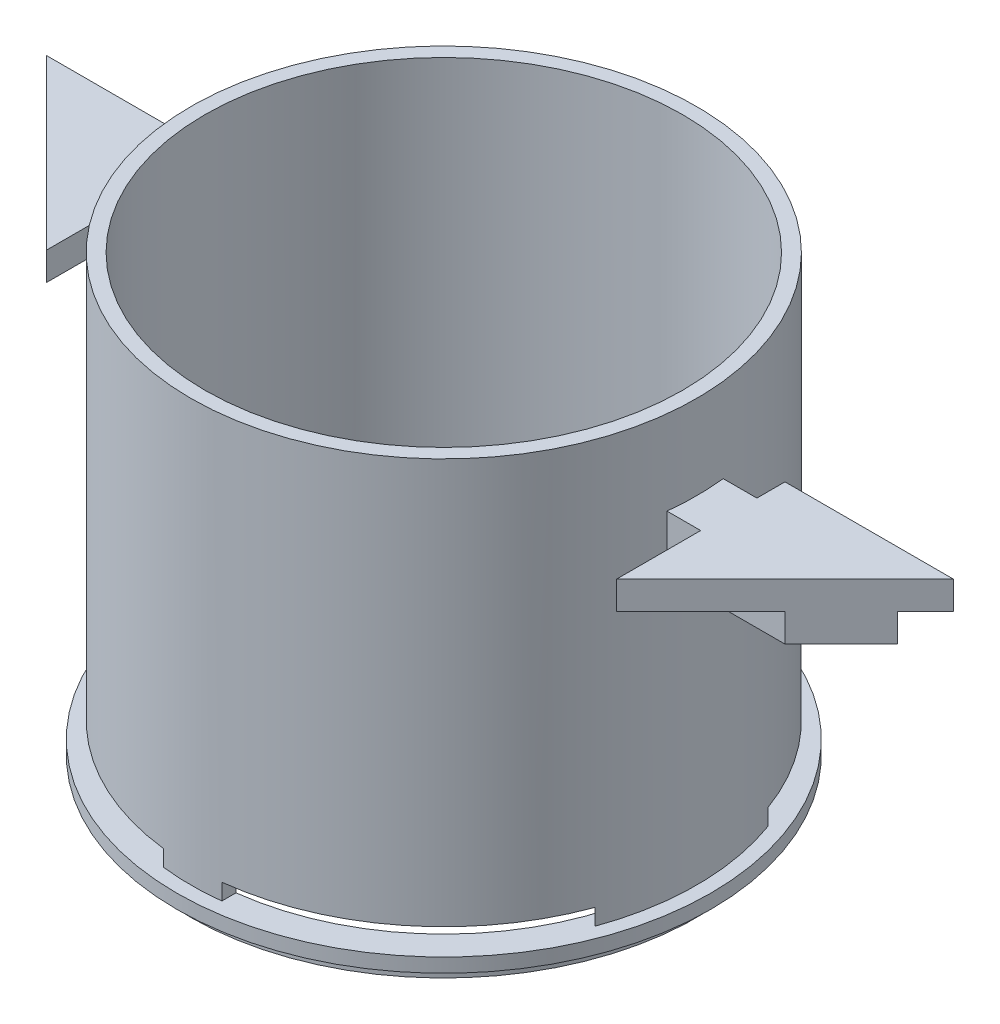
ISO-10303-21;
HEADER;
FILE_DESCRIPTION(('STEP AP214'),'2;1');
FILE_NAME('part.step','',(''),(''),'','','');
FILE_SCHEMA(('AUTOMOTIVE_DESIGN { 1 0 10303 214 1 1 1 1 }'));
ENDSEC;
DATA;
#1=APPLICATION_CONTEXT('core data for automotive mechanical design processes');
#2=APPLICATION_PROTOCOL_DEFINITION('international standard','automotive_design',2000,#1);
#3=PRODUCT_CONTEXT('',#1,'mechanical');
#4=PRODUCT('Part','Part','',(#3));
#5=PRODUCT_RELATED_PRODUCT_CATEGORY('part','',(#4));
#6=PRODUCT_DEFINITION_FORMATION('','',#4);
#7=PRODUCT_DEFINITION_CONTEXT('part definition',#1,'design');
#8=PRODUCT_DEFINITION('design','',#6,#7);
#9=PRODUCT_DEFINITION_SHAPE('','',#8);
#10=(LENGTH_UNIT() NAMED_UNIT(*) SI_UNIT(.MILLI.,.METRE.));
#11=(NAMED_UNIT(*) PLANE_ANGLE_UNIT() SI_UNIT($,.RADIAN.));
#12=(NAMED_UNIT(*) SI_UNIT($,.STERADIAN.) SOLID_ANGLE_UNIT());
#13=UNCERTAINTY_MEASURE_WITH_UNIT(LENGTH_MEASURE(1.E-05),#10,'distance_accuracy_value','');
#14=(GEOMETRIC_REPRESENTATION_CONTEXT(3) GLOBAL_UNCERTAINTY_ASSIGNED_CONTEXT((#13)) GLOBAL_UNIT_ASSIGNED_CONTEXT((#10,
#11,#12)) REPRESENTATION_CONTEXT('',''));
#15=CARTESIAN_POINT('',(0.,0.,0.));
#16=DIRECTION('',(0.,0.,1.));
#17=DIRECTION('',(1.,0.,0.));
#18=AXIS2_PLACEMENT_3D('',#15,#16,#17);
#19=CARTESIAN_POINT('',(96.1525636,82.55,-6.35));
#20=DIRECTION('',(0.,0.,-1.));
#21=DIRECTION('',(-1.,0.,0.));
#22=AXIS2_PLACEMENT_3D('',#19,#20,#21);
#23=PLANE('',#22);
#24=DIRECTION('',(1.,0.,0.));
#25=VECTOR('',#24,1.);
#26=CARTESIAN_POINT('',(96.1525636,82.55,-6.35));
#27=LINE('',#26,#25);
#28=CARTESIAN_POINT('',(56.7961266284947,82.55,-6.35));
#29=VERTEX_POINT('',#28);
#30=CARTESIAN_POINT('',(64.4025636,82.55,-6.35));
#31=VERTEX_POINT('',#30);
#32=EDGE_CURVE('E313',#29,#31,#27,.T.);
#33=ORIENTED_EDGE('',*,*,#32,.T.);
#34=DIRECTION('',(0.,-1.,0.));
#35=VECTOR('',#34,1.);
#36=CARTESIAN_POINT('',(64.4025636,82.55,-6.35));
#37=LINE('',#36,#35);
#38=CARTESIAN_POINT('',(64.4025636,76.2,-6.35));
#39=VERTEX_POINT('',#38);
#40=EDGE_CURVE('E58',#31,#39,#37,.T.);
#41=ORIENTED_EDGE('',*,*,#40,.T.);
#42=DIRECTION('',(1.,0.,0.));
#43=VECTOR('',#42,1.);
#44=CARTESIAN_POINT('',(96.1525636,76.2,-6.35));
#45=LINE('',#44,#43);
#46=CARTESIAN_POINT('',(96.1525636,76.2,-6.35));
#47=VERTEX_POINT('',#46);
#48=EDGE_CURVE('E305',#39,#47,#45,.T.);
#49=ORIENTED_EDGE('',*,*,#48,.T.);
#50=DIRECTION('',(0.,-1.,0.));
#51=VECTOR('',#50,1.);
#52=CARTESIAN_POINT('',(96.1525636,82.55,-6.35));
#53=LINE('',#52,#51);
#54=CARTESIAN_POINT('',(96.1525636,69.85,-6.35));
#55=VERTEX_POINT('',#54);
#56=EDGE_CURVE('E289',#47,#55,#53,.T.);
#57=ORIENTED_EDGE('',*,*,#56,.T.);
#58=DIRECTION('',(1.,0.,0.));
#59=VECTOR('',#58,1.);
#60=CARTESIAN_POINT('',(96.1525636,69.85,-6.35));
#61=LINE('',#60,#59);
#62=CARTESIAN_POINT('',(56.7961266284947,69.85,-6.35));
#63=VERTEX_POINT('',#62);
#64=EDGE_CURVE('E321',#63,#55,#61,.T.);
#65=ORIENTED_EDGE('',*,*,#64,.F.);
#66=DIRECTION('',(0.,-1.,0.));
#67=VECTOR('',#66,1.);
#68=CARTESIAN_POINT('',(56.7961266284947,101.6,-6.35));
#69=LINE('',#68,#67);
#70=EDGE_CURVE('E336',#29,#63,#69,.T.);
#71=ORIENTED_EDGE('',*,*,#70,.F.);
#72=EDGE_LOOP('',(#33,#41,#49,#57,#65,#71));
#73=FACE_BOUND('',#72,.T.);
#74=ADVANCED_FACE('F43',(#73),#23,.T.);
#75=CARTESIAN_POINT('',(83.4525635999997,82.55,6.35));
#76=DIRECTION('',(0.,0.,1.));
#77=DIRECTION('',(1.,0.,0.));
#78=AXIS2_PLACEMENT_3D('',#75,#76,#77);
#79=PLANE('',#78);
#80=DIRECTION('',(-1.,0.,0.));
#81=VECTOR('',#80,1.);
#82=CARTESIAN_POINT('',(83.4525635999997,76.2,6.35));
#83=LINE('',#82,#81);
#84=CARTESIAN_POINT('',(83.4525635999997,76.2,6.35));
#85=VERTEX_POINT('',#84);
#86=CARTESIAN_POINT('',(64.4025636,76.2,6.35));
#87=VERTEX_POINT('',#86);
#88=EDGE_CURVE('E66',#85,#87,#83,.T.);
#89=ORIENTED_EDGE('',*,*,#88,.T.);
#90=DIRECTION('',(0.,1.,0.));
#91=VECTOR('',#90,1.);
#92=CARTESIAN_POINT('',(64.4025636,82.55,6.35));
#93=LINE('',#92,#91);
#94=CARTESIAN_POINT('',(64.4025636,82.55,6.35));
#95=VERTEX_POINT('',#94);
#96=EDGE_CURVE('E307',#87,#95,#93,.T.);
#97=ORIENTED_EDGE('',*,*,#96,.T.);
#98=DIRECTION('',(-1.,0.,0.));
#99=VECTOR('',#98,1.);
#100=CARTESIAN_POINT('',(83.4525635999997,82.55,6.35));
#101=LINE('',#100,#99);
#102=CARTESIAN_POINT('',(56.7961266284947,82.55,6.35));
#103=VERTEX_POINT('',#102);
#104=EDGE_CURVE('E316',#95,#103,#101,.T.);
#105=ORIENTED_EDGE('',*,*,#104,.T.);
#106=DIRECTION('',(0.,-1.,0.));
#107=VECTOR('',#106,1.);
#108=CARTESIAN_POINT('',(56.7961266284947,101.6,6.35));
#109=LINE('',#108,#107);
#110=CARTESIAN_POINT('',(56.7961266284947,69.85,6.35));
#111=VERTEX_POINT('',#110);
#112=EDGE_CURVE('E333',#111,#103,#109,.F.);
#113=ORIENTED_EDGE('',*,*,#112,.F.);
#114=DIRECTION('',(-1.,0.,0.));
#115=VECTOR('',#114,1.);
#116=CARTESIAN_POINT('',(83.4525635999997,69.85,6.35));
#117=LINE('',#116,#115);
#118=CARTESIAN_POINT('',(83.4525635999997,69.85,6.35));
#119=VERTEX_POINT('',#118);
#120=EDGE_CURVE('E314',#119,#111,#117,.T.);
#121=ORIENTED_EDGE('',*,*,#120,.F.);
#122=DIRECTION('',(0.,-1.,0.));
#123=VECTOR('',#122,1.);
#124=CARTESIAN_POINT('',(83.4525635999997,82.55,6.35));
#125=LINE('',#124,#123);
#126=EDGE_CURVE('E318',#85,#119,#125,.T.);
#127=ORIENTED_EDGE('',*,*,#126,.F.);
#128=EDGE_LOOP('',(#89,#97,#105,#113,#121,#127));
#129=FACE_BOUND('',#128,.T.);
#130=ADVANCED_FACE('F591',(#129),#79,.T.);
#131=CARTESIAN_POINT('',(0.,101.6,0.));
#132=DIRECTION('',(0.,-1.,0.));
#133=DIRECTION('',(0.,0.,-1.));
#134=AXIS2_PLACEMENT_3D('',#131,#132,#133);
#135=CYLINDRICAL_SURFACE('',#134,57.15);
#136=CARTESIAN_POINT('',(0.,0.,0.));
#137=DIRECTION('',(0.,1.,0.));
#138=DIRECTION('',(0.,0.,1.));
#139=AXIS2_PLACEMENT_3D('',#136,#137,#138);
#140=CIRCLE('',#139,57.15);
#141=CARTESIAN_POINT('',(0.,0.,57.15));
#142=VERTEX_POINT('',#141);
#143=EDGE_CURVE('E481',#142,#142,#140,.T.);
#144=ORIENTED_EDGE('',*,*,#143,.T.);
#145=EDGE_LOOP('',(#144));
#146=FACE_BOUND('',#145,.T.);
#147=CARTESIAN_POINT('',(0.,3.175,0.));
#148=DIRECTION('',(0.,1.,0.));
#149=DIRECTION('',(0.,0.,1.));
#150=AXIS2_PLACEMENT_3D('',#147,#148,#149);
#151=CIRCLE('',#150,57.15);
#152=CARTESIAN_POINT('',(0.,3.175,57.15));
#153=VERTEX_POINT('',#152);
#154=EDGE_CURVE('E11',#153,#153,#151,.T.);
#155=ORIENTED_EDGE('',*,*,#154,.F.);
#156=EDGE_LOOP('',(#155));
#157=FACE_BOUND('',#156,.T.);
#158=ADVANCED_FACE('F596',(#146,#157),#135,.T.);
#159=ORIENTED_EDGE('',*,*,#112,.T.);
#160=CARTESIAN_POINT('',(0.,82.55,0.));
#161=DIRECTION('',(0.,1.,0.));
#162=DIRECTION('',(0.,0.,1.));
#163=AXIS2_PLACEMENT_3D('',#160,#161,#162);
#164=CIRCLE('',#163,57.15);
#165=EDGE_CURVE('E331',#103,#29,#164,.T.);
#166=ORIENTED_EDGE('',*,*,#165,.T.);
#167=ORIENTED_EDGE('',*,*,#70,.T.);
#168=CARTESIAN_POINT('',(0.,69.85,0.));
#169=DIRECTION('',(0.,1.,0.));
#170=DIRECTION('',(0.,0.,1.));
#171=AXIS2_PLACEMENT_3D('',#168,#169,#170);
#172=CIRCLE('',#171,57.15);
#173=EDGE_CURVE('E328',#111,#63,#172,.T.);
#174=ORIENTED_EDGE('',*,*,#173,.F.);
#175=EDGE_LOOP('',(#159,#166,#167,#174));
#176=FACE_BOUND('',#175,.T.);
#177=DIRECTION('',(0.,-1.,0.));
#178=VECTOR('',#177,1.);
#179=CARTESIAN_POINT('',(-56.7961266284947,101.6,-6.35));
#180=LINE('',#179,#178);
#181=CARTESIAN_POINT('',(-56.7961266284947,82.55,-6.35));
#182=VERTEX_POINT('',#181);
#183=CARTESIAN_POINT('',(-56.7961266284947,69.85,-6.35));
#184=VERTEX_POINT('',#183);
#185=EDGE_CURVE('E400',#182,#184,#180,.T.);
#186=ORIENTED_EDGE('',*,*,#185,.F.);
#187=CARTESIAN_POINT('',(0.,82.55,0.));
#188=DIRECTION('',(0.,1.,0.));
#189=DIRECTION('',(0.,0.,1.));
#190=AXIS2_PLACEMENT_3D('',#187,#188,#189);
#191=CIRCLE('',#190,57.15);
#192=CARTESIAN_POINT('',(-56.7961266284947,82.55,6.35));
#193=VERTEX_POINT('',#192);
#194=EDGE_CURVE('E397',#182,#193,#191,.T.);
#195=ORIENTED_EDGE('',*,*,#194,.T.);
#196=DIRECTION('',(0.,-1.,0.));
#197=VECTOR('',#196,1.);
#198=CARTESIAN_POINT('',(-56.7961266284947,101.6,6.35));
#199=LINE('',#198,#197);
#200=CARTESIAN_POINT('',(-56.7961266284947,69.85,6.35));
#201=VERTEX_POINT('',#200);
#202=EDGE_CURVE('E403',#201,#193,#199,.F.);
#203=ORIENTED_EDGE('',*,*,#202,.F.);
#204=CARTESIAN_POINT('',(0.,69.85,0.));
#205=DIRECTION('',(0.,1.,0.));
#206=DIRECTION('',(0.,0.,1.));
#207=AXIS2_PLACEMENT_3D('',#204,#205,#206);
#208=CIRCLE('',#207,57.15);
#209=EDGE_CURVE('E394',#184,#201,#208,.T.);
#210=ORIENTED_EDGE('',*,*,#209,.F.);
#211=EDGE_LOOP('',(#186,#195,#203,#210));
#212=FACE_BOUND('',#211,.T.);
#213=DIRECTION('',(0.,-1.,0.));
#214=VECTOR('',#213,1.);
#215=CARTESIAN_POINT('',(53.721,101.6,19.4981193708522));
#216=LINE('',#215,#214);
#217=CARTESIAN_POINT('',(53.721,10.033,19.4981193708522));
#218=VERTEX_POINT('',#217);
#219=CARTESIAN_POINT('',(53.721,6.34999999999999,19.4981193708522));
#220=VERTEX_POINT('',#219);
#221=EDGE_CURVE('E454',#218,#220,#216,.T.);
#222=ORIENTED_EDGE('',*,*,#221,.T.);
#223=CARTESIAN_POINT('',(0.,6.35,0.));
#224=DIRECTION('',(0.,1.,0.));
#225=DIRECTION('',(0.,0.,1.));
#226=AXIS2_PLACEMENT_3D('',#223,#224,#225);
#227=CIRCLE('',#226,57.15);
#228=CARTESIAN_POINT('',(53.721,6.34999999999999,-19.4981193708522));
#229=VERTEX_POINT('',#228);
#230=EDGE_CURVE('E409',#220,#229,#227,.T.);
#231=ORIENTED_EDGE('',*,*,#230,.T.);
#232=DIRECTION('',(0.,-1.,0.));
#233=VECTOR('',#232,1.);
#234=CARTESIAN_POINT('',(53.721,101.6,-19.4981193708522));
#235=LINE('',#234,#233);
#236=CARTESIAN_POINT('',(53.721,10.033,-19.4981193708522));
#237=VERTEX_POINT('',#236);
#238=EDGE_CURVE('E451',#229,#237,#235,.F.);
#239=ORIENTED_EDGE('',*,*,#238,.T.);
#240=CARTESIAN_POINT('',(0.,10.033,0.));
#241=DIRECTION('',(0.,1.,0.));
#242=DIRECTION('',(0.,0.,1.));
#243=AXIS2_PLACEMENT_3D('',#240,#241,#242);
#244=CIRCLE('',#243,57.15);
#245=CARTESIAN_POINT('',(6.604,10.033,-56.7671532138084));
#246=VERTEX_POINT('',#245);
#247=EDGE_CURVE('E457',#237,#246,#244,.T.);
#248=ORIENTED_EDGE('',*,*,#247,.T.);
#249=DIRECTION('',(0.,-1.,0.));
#250=VECTOR('',#249,1.);
#251=CARTESIAN_POINT('',(6.604,101.6,-56.7671532138084));
#252=LINE('',#251,#250);
#253=CARTESIAN_POINT('',(6.604,6.34999999999999,-56.7671532138084));
#254=VERTEX_POINT('',#253);
#255=EDGE_CURVE('E448',#246,#254,#252,.T.);
#256=ORIENTED_EDGE('',*,*,#255,.T.);
#257=CARTESIAN_POINT('',(-6.604,6.35,-56.7671532138084));
#258=VERTEX_POINT('',#257);
#259=EDGE_CURVE('E549',#254,#258,#227,.T.);
#260=ORIENTED_EDGE('',*,*,#259,.T.);
#261=DIRECTION('',(0.,-1.,0.));
#262=VECTOR('',#261,1.);
#263=CARTESIAN_POINT('',(-6.604,101.6,-56.7671532138084));
#264=LINE('',#263,#262);
#265=CARTESIAN_POINT('',(-6.604,10.033,-56.7671532138084));
#266=VERTEX_POINT('',#265);
#267=EDGE_CURVE('E461',#258,#266,#264,.F.);
#268=ORIENTED_EDGE('',*,*,#267,.T.);
#269=CARTESIAN_POINT('',(0.,10.033,0.));
#270=DIRECTION('',(0.,1.,0.));
#271=DIRECTION('',(0.,0.,1.));
#272=AXIS2_PLACEMENT_3D('',#269,#270,#271);
#273=CIRCLE('',#272,57.15);
#274=CARTESIAN_POINT('',(-53.721,10.033,-19.4981193708522));
#275=VERTEX_POINT('',#274);
#276=EDGE_CURVE('E470',#266,#275,#273,.T.);
#277=ORIENTED_EDGE('',*,*,#276,.T.);
#278=DIRECTION('',(0.,-1.,0.));
#279=VECTOR('',#278,1.);
#280=CARTESIAN_POINT('',(-53.721,101.6,-19.4981193708522));
#281=LINE('',#280,#279);
#282=CARTESIAN_POINT('',(-53.721,6.34999999999999,-19.4981193708522));
#283=VERTEX_POINT('',#282);
#284=EDGE_CURVE('E474',#275,#283,#281,.T.);
#285=ORIENTED_EDGE('',*,*,#284,.T.);
#286=CARTESIAN_POINT('',(-53.721,6.34999999999999,19.4981193708522));
#287=VERTEX_POINT('',#286);
#288=EDGE_CURVE('E408',#283,#287,#227,.T.);
#289=ORIENTED_EDGE('',*,*,#288,.T.);
#290=DIRECTION('',(0.,-1.,0.));
#291=VECTOR('',#290,1.);
#292=CARTESIAN_POINT('',(-53.721,101.6,19.4981193708522));
#293=LINE('',#292,#291);
#294=CARTESIAN_POINT('',(-53.721,10.033,19.4981193708522));
#295=VERTEX_POINT('',#294);
#296=EDGE_CURVE('E471',#287,#295,#293,.F.);
#297=ORIENTED_EDGE('',*,*,#296,.T.);
#298=CARTESIAN_POINT('',(-6.604,10.033,56.7671532138084));
#299=VERTEX_POINT('',#298);
#300=EDGE_CURVE('E467',#295,#299,#273,.T.);
#301=ORIENTED_EDGE('',*,*,#300,.T.);
#302=DIRECTION('',(0.,-1.,0.));
#303=VECTOR('',#302,1.);
#304=CARTESIAN_POINT('',(-6.604,101.6,56.7671532138084));
#305=LINE('',#304,#303);
#306=CARTESIAN_POINT('',(-6.604,6.34999999999999,56.7671532138084));
#307=VERTEX_POINT('',#306);
#308=EDGE_CURVE('E464',#299,#307,#305,.T.);
#309=ORIENTED_EDGE('',*,*,#308,.T.);
#310=CARTESIAN_POINT('',(6.604,6.35,56.7671532138084));
#311=VERTEX_POINT('',#310);
#312=EDGE_CURVE('E406',#307,#311,#227,.T.);
#313=ORIENTED_EDGE('',*,*,#312,.T.);
#314=DIRECTION('',(0.,-1.,0.));
#315=VECTOR('',#314,1.);
#316=CARTESIAN_POINT('',(6.604,101.6,56.7671532138084));
#317=LINE('',#316,#315);
#318=CARTESIAN_POINT('',(6.604,10.033,56.7671532138084));
#319=VERTEX_POINT('',#318);
#320=EDGE_CURVE('E445',#311,#319,#317,.F.);
#321=ORIENTED_EDGE('',*,*,#320,.T.);
#322=EDGE_CURVE('E460',#319,#218,#244,.T.);
#323=ORIENTED_EDGE('',*,*,#322,.T.);
#324=EDGE_LOOP('',(#222,#231,#239,#248,#256,#260,#268,#277,#285,#289,#297,#301,#309,#313,#321,#323));
#325=FACE_BOUND('',#324,.T.);
#326=CARTESIAN_POINT('',(0.,101.6,0.));
#327=DIRECTION('',(0.,1.,0.));
#328=DIRECTION('',(0.,0.,1.));
#329=AXIS2_PLACEMENT_3D('',#326,#327,#328);
#330=CIRCLE('',#329,57.15);
#331=CARTESIAN_POINT('',(0.,101.6,57.15));
#332=VERTEX_POINT('',#331);
#333=EDGE_CURVE('E484',#332,#332,#330,.T.);
#334=ORIENTED_EDGE('',*,*,#333,.F.);
#335=EDGE_LOOP('',(#334));
#336=FACE_BOUND('',#335,.T.);
#337=ADVANCED_FACE('F45',(#176,#212,#325,#336),#135,.T.);
#338=CARTESIAN_POINT('',(0.,101.6,0.));
#339=DIRECTION('',(0.,1.,0.));
#340=DIRECTION('',(0.,0.,1.));
#341=AXIS2_PLACEMENT_3D('',#338,#339,#340);
#342=PLANE('',#341);
#343=CARTESIAN_POINT('',(0.,101.6,0.));
#344=DIRECTION('',(0.,1.,0.));
#345=DIRECTION('',(0.,0.,1.));
#346=AXIS2_PLACEMENT_3D('',#343,#344,#345);
#347=CIRCLE('',#346,53.975);
#348=CARTESIAN_POINT('',(0.,101.6,53.975));
#349=VERTEX_POINT('',#348);
#350=EDGE_CURVE('E477',#349,#349,#347,.T.);
#351=ORIENTED_EDGE('',*,*,#350,.F.);
#352=EDGE_LOOP('',(#351));
#353=FACE_BOUND('',#352,.T.);
#354=ORIENTED_EDGE('',*,*,#333,.T.);
#355=EDGE_LOOP('',(#354));
#356=FACE_BOUND('',#355,.T.);
#357=ADVANCED_FACE('F654',(#353,#356),#342,.T.);
#358=CARTESIAN_POINT('',(0.,0.,0.));
#359=DIRECTION('',(0.,1.,0.));
#360=DIRECTION('',(0.,0.,1.));
#361=AXIS2_PLACEMENT_3D('',#358,#359,#360);
#362=PLANE('',#361);
#363=CARTESIAN_POINT('',(0.,0.,0.));
#364=DIRECTION('',(0.,1.,0.));
#365=DIRECTION('',(0.,0.,1.));
#366=AXIS2_PLACEMENT_3D('',#363,#364,#365);
#367=CIRCLE('',#366,53.975);
#368=CARTESIAN_POINT('',(0.,0.,53.975));
#369=VERTEX_POINT('',#368);
#370=EDGE_CURVE('E478',#369,#369,#367,.T.);
#371=ORIENTED_EDGE('',*,*,#370,.T.);
#372=EDGE_LOOP('',(#371));
#373=FACE_BOUND('',#372,.T.);
#374=ORIENTED_EDGE('',*,*,#143,.F.);
#375=EDGE_LOOP('',(#374));
#376=FACE_BOUND('',#375,.T.);
#377=ADVANCED_FACE('F658',(#373,#376),#362,.F.);
#378=CARTESIAN_POINT('',(0.,0.,0.));
#379=DIRECTION('',(0.,1.,0.));
#380=DIRECTION('',(0.,0.,1.));
#381=AXIS2_PLACEMENT_3D('',#378,#379,#380);
#382=CYLINDRICAL_SURFACE('',#381,53.975);
#383=CARTESIAN_POINT('',(0.,6.35,0.));
#384=DIRECTION('',(0.,-1.,0.));
#385=DIRECTION('',(0.,0.,-1.));
#386=AXIS2_PLACEMENT_3D('',#383,#384,#385);
#387=CIRCLE('',#386,53.975);
#388=CARTESIAN_POINT('',(-6.604,6.35,-53.5694671338067));
#389=VERTEX_POINT('',#388);
#390=CARTESIAN_POINT('',(-53.721,6.35,-5.23018011162149));
#391=VERTEX_POINT('',#390);
#392=EDGE_CURVE('E513',#389,#391,#387,.F.);
#393=ORIENTED_EDGE('',*,*,#392,.T.);
#394=DIRECTION('',(0.,1.,0.));
#395=VECTOR('',#394,1.);
#396=CARTESIAN_POINT('',(-53.721,0.,-5.23018011162149));
#397=LINE('',#396,#395);
#398=CARTESIAN_POINT('',(-53.721,10.033,-5.23018011162149));
#399=VERTEX_POINT('',#398);
#400=EDGE_CURVE('E51',#391,#399,#397,.T.);
#401=ORIENTED_EDGE('',*,*,#400,.T.);
#402=CARTESIAN_POINT('',(0.,10.033,0.));
#403=DIRECTION('',(0.,1.,0.));
#404=DIRECTION('',(0.,0.,1.));
#405=AXIS2_PLACEMENT_3D('',#402,#403,#404);
#406=CIRCLE('',#405,53.975);
#407=CARTESIAN_POINT('',(-6.604,10.033,-53.5694671338067));
#408=VERTEX_POINT('',#407);
#409=EDGE_CURVE('E520',#399,#408,#406,.F.);
#410=ORIENTED_EDGE('',*,*,#409,.T.);
#411=DIRECTION('',(0.,1.,0.));
#412=VECTOR('',#411,1.);
#413=CARTESIAN_POINT('',(-6.604,0.,-53.5694671338067));
#414=LINE('',#413,#412);
#415=EDGE_CURVE('E523',#408,#389,#414,.F.);
#416=ORIENTED_EDGE('',*,*,#415,.T.);
#417=EDGE_LOOP('',(#393,#401,#410,#416));
#418=FACE_BOUND('',#417,.T.);
#419=CARTESIAN_POINT('',(-6.604,10.033,53.5694671338067));
#420=VERTEX_POINT('',#419);
#421=CARTESIAN_POINT('',(-53.721,10.033,5.23018011162149));
#422=VERTEX_POINT('',#421);
#423=EDGE_CURVE('E516',#420,#422,#406,.F.);
#424=ORIENTED_EDGE('',*,*,#423,.T.);
#425=DIRECTION('',(0.,1.,0.));
#426=VECTOR('',#425,1.);
#427=CARTESIAN_POINT('',(-53.721,0.,5.23018011162149));
#428=LINE('',#427,#426);
#429=CARTESIAN_POINT('',(-53.721,6.35,5.23018011162149));
#430=VERTEX_POINT('',#429);
#431=EDGE_CURVE('E519',#422,#430,#428,.F.);
#432=ORIENTED_EDGE('',*,*,#431,.T.);
#433=CARTESIAN_POINT('',(-6.604,6.35,53.5694671338067));
#434=VERTEX_POINT('',#433);
#435=EDGE_CURVE('E509',#430,#434,#387,.F.);
#436=ORIENTED_EDGE('',*,*,#435,.T.);
#437=DIRECTION('',(0.,1.,0.));
#438=VECTOR('',#437,1.);
#439=CARTESIAN_POINT('',(-6.604,0.,53.5694671338067));
#440=LINE('',#439,#438);
#441=EDGE_CURVE('E512',#434,#420,#440,.T.);
#442=ORIENTED_EDGE('',*,*,#441,.T.);
#443=EDGE_LOOP('',(#424,#432,#436,#442));
#444=FACE_BOUND('',#443,.T.);
#445=DIRECTION('',(0.,1.,0.));
#446=VECTOR('',#445,1.);
#447=CARTESIAN_POINT('',(53.721,0.,5.23018011162149));
#448=LINE('',#447,#446);
#449=CARTESIAN_POINT('',(53.721,6.35,5.23018011162149));
#450=VERTEX_POINT('',#449);
#451=CARTESIAN_POINT('',(53.721,10.033,5.23018011162148));
#452=VERTEX_POINT('',#451);
#453=EDGE_CURVE('E506',#450,#452,#448,.T.);
#454=ORIENTED_EDGE('',*,*,#453,.T.);
#455=CARTESIAN_POINT('',(0.,10.033,0.));
#456=DIRECTION('',(0.,1.,0.));
#457=DIRECTION('',(0.,0.,1.));
#458=AXIS2_PLACEMENT_3D('',#455,#456,#457);
#459=CIRCLE('',#458,53.975);
#460=CARTESIAN_POINT('',(6.604,10.033,53.5694671338067));
#461=VERTEX_POINT('',#460);
#462=EDGE_CURVE('E503',#452,#461,#459,.F.);
#463=ORIENTED_EDGE('',*,*,#462,.T.);
#464=DIRECTION('',(0.,1.,0.));
#465=VECTOR('',#464,1.);
#466=CARTESIAN_POINT('',(6.604,0.,53.5694671338067));
#467=LINE('',#466,#465);
#468=CARTESIAN_POINT('',(6.604,6.35,53.5694671338067));
#469=VERTEX_POINT('',#468);
#470=EDGE_CURVE('E502',#461,#469,#467,.F.);
#471=ORIENTED_EDGE('',*,*,#470,.T.);
#472=CARTESIAN_POINT('',(0.,6.35,0.));
#473=DIRECTION('',(0.,-1.,0.));
#474=DIRECTION('',(0.,0.,-1.));
#475=AXIS2_PLACEMENT_3D('',#472,#473,#474);
#476=CIRCLE('',#475,53.975);
#477=EDGE_CURVE('E496',#469,#450,#476,.F.);
#478=ORIENTED_EDGE('',*,*,#477,.T.);
#479=EDGE_LOOP('',(#454,#463,#471,#478));
#480=FACE_BOUND('',#479,.T.);
#481=DIRECTION('',(0.,1.,0.));
#482=VECTOR('',#481,1.);
#483=CARTESIAN_POINT('',(6.604,0.,-53.5694671338067));
#484=LINE('',#483,#482);
#485=CARTESIAN_POINT('',(6.604,6.35,-53.5694671338067));
#486=VERTEX_POINT('',#485);
#487=CARTESIAN_POINT('',(6.604,10.033,-53.5694671338067));
#488=VERTEX_POINT('',#487);
#489=EDGE_CURVE('E487',#486,#488,#484,.T.);
#490=ORIENTED_EDGE('',*,*,#489,.T.);
#491=CARTESIAN_POINT('',(53.721,10.033,-5.2301801116215));
#492=VERTEX_POINT('',#491);
#493=EDGE_CURVE('E499',#488,#492,#459,.F.);
#494=ORIENTED_EDGE('',*,*,#493,.T.);
#495=DIRECTION('',(0.,1.,0.));
#496=VECTOR('',#495,1.);
#497=CARTESIAN_POINT('',(53.721,0.,-5.23018011162149));
#498=LINE('',#497,#496);
#499=CARTESIAN_POINT('',(53.721,6.35,-5.23018011162149));
#500=VERTEX_POINT('',#499);
#501=EDGE_CURVE('E495',#492,#500,#498,.F.);
#502=ORIENTED_EDGE('',*,*,#501,.T.);
#503=EDGE_CURVE('E492',#500,#486,#476,.F.);
#504=ORIENTED_EDGE('',*,*,#503,.T.);
#505=EDGE_LOOP('',(#490,#494,#502,#504));
#506=FACE_BOUND('',#505,.T.);
#507=ORIENTED_EDGE('',*,*,#370,.F.);
#508=EDGE_LOOP('',(#507));
#509=FACE_BOUND('',#508,.T.);
#510=ORIENTED_EDGE('',*,*,#350,.T.);
#511=EDGE_LOOP('',(#510));
#512=FACE_BOUND('',#511,.T.);
#513=ADVANCED_FACE('F530',(#418,#444,#480,#506,#509,#512),#382,.F.);
#514=CARTESIAN_POINT('',(6.604,10.033,-57.15));
#515=DIRECTION('',(-1.,0.,0.));
#516=DIRECTION('',(0.,0.,1.));
#517=AXIS2_PLACEMENT_3D('',#514,#515,#516);
#518=PLANE('',#517);
#519=DIRECTION('',(0.,0.,1.));
#520=VECTOR('',#519,1.);
#521=CARTESIAN_POINT('',(6.604,10.033,-57.15));
#522=LINE('',#521,#520);
#523=EDGE_CURVE('E432',#246,#488,#522,.T.);
#524=ORIENTED_EDGE('',*,*,#523,.T.);
#525=ORIENTED_EDGE('',*,*,#489,.F.);
#526=DIRECTION('',(0.,0.,1.));
#527=VECTOR('',#526,1.);
#528=CARTESIAN_POINT('',(6.604,6.35,-57.15));
#529=LINE('',#528,#527);
#530=EDGE_CURVE('E435',#254,#486,#529,.T.);
#531=ORIENTED_EDGE('',*,*,#530,.F.);
#532=ORIENTED_EDGE('',*,*,#255,.F.);
#533=EDGE_LOOP('',(#524,#525,#531,#532));
#534=FACE_BOUND('',#533,.T.);
#535=ADVANCED_FACE('F665',(#534),#518,.F.);
#536=CARTESIAN_POINT('',(53.721,10.033,-57.15));
#537=DIRECTION('',(1.,0.,0.));
#538=DIRECTION('',(0.,0.,-1.));
#539=AXIS2_PLACEMENT_3D('',#536,#537,#538);
#540=PLANE('',#539);
#541=DIRECTION('',(0.,0.,1.));
#542=VECTOR('',#541,1.);
#543=CARTESIAN_POINT('',(53.721,6.35,-57.15));
#544=LINE('',#543,#542);
#545=EDGE_CURVE('E439',#229,#500,#544,.T.);
#546=ORIENTED_EDGE('',*,*,#545,.T.);
#547=ORIENTED_EDGE('',*,*,#501,.F.);
#548=DIRECTION('',(0.,0.,1.));
#549=VECTOR('',#548,1.);
#550=CARTESIAN_POINT('',(53.721,10.033,-57.15));
#551=LINE('',#550,#549);
#552=EDGE_CURVE('E442',#237,#492,#551,.T.);
#553=ORIENTED_EDGE('',*,*,#552,.F.);
#554=ORIENTED_EDGE('',*,*,#238,.F.);
#555=EDGE_LOOP('',(#546,#547,#553,#554));
#556=FACE_BOUND('',#555,.T.);
#557=ADVANCED_FACE('F560',(#556),#540,.F.);
#558=CARTESIAN_POINT('',(53.721,10.033,-57.15));
#559=DIRECTION('',(0.,1.,0.));
#560=DIRECTION('',(0.,0.,1.));
#561=AXIS2_PLACEMENT_3D('',#558,#559,#560);
#562=PLANE('',#561);
#563=ORIENTED_EDGE('',*,*,#552,.T.);
#564=ORIENTED_EDGE('',*,*,#493,.F.);
#565=ORIENTED_EDGE('',*,*,#523,.F.);
#566=ORIENTED_EDGE('',*,*,#247,.F.);
#567=EDGE_LOOP('',(#563,#564,#565,#566));
#568=FACE_BOUND('',#567,.T.);
#569=ADVANCED_FACE('F567',(#568),#562,.F.);
#570=EDGE_CURVE('E433',#461,#319,#522,.T.);
#571=ORIENTED_EDGE('',*,*,#570,.F.);
#572=ORIENTED_EDGE('',*,*,#462,.F.);
#573=EDGE_CURVE('E413',#452,#218,#551,.T.);
#574=ORIENTED_EDGE('',*,*,#573,.T.);
#575=ORIENTED_EDGE('',*,*,#322,.F.);
#576=EDGE_LOOP('',(#571,#572,#574,#575));
#577=FACE_BOUND('',#576,.T.);
#578=ADVANCED_FACE('F674',(#577),#562,.F.);
#579=ORIENTED_EDGE('',*,*,#573,.F.);
#580=ORIENTED_EDGE('',*,*,#453,.F.);
#581=EDGE_CURVE('E440',#450,#220,#544,.T.);
#582=ORIENTED_EDGE('',*,*,#581,.T.);
#583=ORIENTED_EDGE('',*,*,#221,.F.);
#584=EDGE_LOOP('',(#579,#580,#582,#583));
#585=FACE_BOUND('',#584,.T.);
#586=ADVANCED_FACE('F670',(#585),#540,.F.);
#587=EDGE_CURVE('E436',#469,#311,#529,.T.);
#588=ORIENTED_EDGE('',*,*,#587,.F.);
#589=ORIENTED_EDGE('',*,*,#470,.F.);
#590=ORIENTED_EDGE('',*,*,#570,.T.);
#591=ORIENTED_EDGE('',*,*,#320,.F.);
#592=EDGE_LOOP('',(#588,#589,#590,#591));
#593=FACE_BOUND('',#592,.T.);
#594=ADVANCED_FACE('F673',(#593),#518,.F.);
#595=CARTESIAN_POINT('',(-53.721,6.35,-57.15));
#596=DIRECTION('',(0.,-1.,0.));
#597=DIRECTION('',(0.,0.,-1.));
#598=AXIS2_PLACEMENT_3D('',#595,#596,#597);
#599=PLANE('',#598);
#600=DIRECTION('',(0.,0.,1.));
#601=VECTOR('',#600,1.);
#602=CARTESIAN_POINT('',(-6.604,6.35,-57.15));
#603=LINE('',#602,#601);
#604=EDGE_CURVE('E426',#434,#307,#603,.T.);
#605=ORIENTED_EDGE('',*,*,#604,.F.);
#606=ORIENTED_EDGE('',*,*,#435,.F.);
#607=DIRECTION('',(0.,0.,1.));
#608=VECTOR('',#607,1.);
#609=CARTESIAN_POINT('',(-53.721,6.35,-57.15));
#610=LINE('',#609,#608);
#611=EDGE_CURVE('E429',#430,#287,#610,.T.);
#612=ORIENTED_EDGE('',*,*,#611,.T.);
#613=ORIENTED_EDGE('',*,*,#288,.F.);
#614=EDGE_CURVE('E428',#283,#391,#610,.T.);
#615=ORIENTED_EDGE('',*,*,#614,.T.);
#616=ORIENTED_EDGE('',*,*,#392,.F.);
#617=EDGE_CURVE('E425',#258,#389,#603,.T.);
#618=ORIENTED_EDGE('',*,*,#617,.F.);
#619=ORIENTED_EDGE('',*,*,#259,.F.);
#620=ORIENTED_EDGE('',*,*,#530,.T.);
#621=ORIENTED_EDGE('',*,*,#503,.F.);
#622=ORIENTED_EDGE('',*,*,#545,.F.);
#623=ORIENTED_EDGE('',*,*,#230,.F.);
#624=ORIENTED_EDGE('',*,*,#581,.F.);
#625=ORIENTED_EDGE('',*,*,#477,.F.);
#626=ORIENTED_EDGE('',*,*,#587,.T.);
#627=ORIENTED_EDGE('',*,*,#312,.F.);
#628=EDGE_LOOP('',(#605,#606,#612,#613,#615,#616,#618,#619,#620,#621,#622,#623,#624,#625,#626,#627));
#629=FACE_BOUND('',#628,.T.);
#630=CARTESIAN_POINT('',(0.,6.35,0.));
#631=DIRECTION('',(0.,1.,0.));
#632=DIRECTION('',(0.,0.,1.));
#633=AXIS2_PLACEMENT_3D('',#630,#631,#632);
#634=CIRCLE('',#633,60.325);
#635=CARTESIAN_POINT('',(0.,6.35,60.325));
#636=VERTEX_POINT('',#635);
#637=EDGE_CURVE('E410',#636,#636,#634,.T.);
#638=ORIENTED_EDGE('',*,*,#637,.T.);
#639=EDGE_LOOP('',(#638));
#640=FACE_BOUND('',#639,.T.);
#641=ADVANCED_FACE('F545',(#629,#640),#599,.F.);
#642=CARTESIAN_POINT('',(-6.604,10.033,-57.15));
#643=DIRECTION('',(1.,0.,0.));
#644=DIRECTION('',(0.,0.,-1.));
#645=AXIS2_PLACEMENT_3D('',#642,#643,#644);
#646=PLANE('',#645);
#647=DIRECTION('',(0.,0.,1.));
#648=VECTOR('',#647,1.);
#649=CARTESIAN_POINT('',(-6.604,10.033,-57.15));
#650=LINE('',#649,#648);
#651=EDGE_CURVE('E422',#420,#299,#650,.T.);
#652=ORIENTED_EDGE('',*,*,#651,.F.);
#653=ORIENTED_EDGE('',*,*,#441,.F.);
#654=ORIENTED_EDGE('',*,*,#604,.T.);
#655=ORIENTED_EDGE('',*,*,#308,.F.);
#656=EDGE_LOOP('',(#652,#653,#654,#655));
#657=FACE_BOUND('',#656,.T.);
#658=ADVANCED_FACE('F577',(#657),#646,.F.);
#659=CARTESIAN_POINT('',(-53.721,10.033,-57.15));
#660=DIRECTION('',(0.,1.,0.));
#661=DIRECTION('',(0.,0.,1.));
#662=AXIS2_PLACEMENT_3D('',#659,#660,#661);
#663=PLANE('',#662);
#664=DIRECTION('',(0.,0.,1.));
#665=VECTOR('',#664,1.);
#666=CARTESIAN_POINT('',(-53.721,10.033,-57.15));
#667=LINE('',#666,#665);
#668=EDGE_CURVE('E417',#422,#295,#667,.T.);
#669=ORIENTED_EDGE('',*,*,#668,.F.);
#670=ORIENTED_EDGE('',*,*,#423,.F.);
#671=ORIENTED_EDGE('',*,*,#651,.T.);
#672=ORIENTED_EDGE('',*,*,#300,.F.);
#673=EDGE_LOOP('',(#669,#670,#671,#672));
#674=FACE_BOUND('',#673,.T.);
#675=ADVANCED_FACE('F586',(#674),#663,.F.);
#676=CARTESIAN_POINT('',(-53.721,10.033,-57.15));
#677=DIRECTION('',(-1.,0.,0.));
#678=DIRECTION('',(0.,0.,1.));
#679=AXIS2_PLACEMENT_3D('',#676,#677,#678);
#680=PLANE('',#679);
#681=ORIENTED_EDGE('',*,*,#611,.F.);
#682=ORIENTED_EDGE('',*,*,#431,.F.);
#683=ORIENTED_EDGE('',*,*,#668,.T.);
#684=ORIENTED_EDGE('',*,*,#296,.F.);
#685=EDGE_LOOP('',(#681,#682,#683,#684));
#686=FACE_BOUND('',#685,.T.);
#687=ADVANCED_FACE('F682',(#686),#680,.F.);
#688=EDGE_CURVE('E420',#275,#399,#667,.T.);
#689=ORIENTED_EDGE('',*,*,#688,.T.);
#690=ORIENTED_EDGE('',*,*,#400,.F.);
#691=ORIENTED_EDGE('',*,*,#614,.F.);
#692=ORIENTED_EDGE('',*,*,#284,.F.);
#693=EDGE_LOOP('',(#689,#690,#691,#692));
#694=FACE_BOUND('',#693,.T.);
#695=ADVANCED_FACE('F540',(#694),#680,.F.);
#696=EDGE_CURVE('E421',#266,#408,#650,.T.);
#697=ORIENTED_EDGE('',*,*,#696,.T.);
#698=ORIENTED_EDGE('',*,*,#409,.F.);
#699=ORIENTED_EDGE('',*,*,#688,.F.);
#700=ORIENTED_EDGE('',*,*,#276,.F.);
#701=EDGE_LOOP('',(#697,#698,#699,#700));
#702=FACE_BOUND('',#701,.T.);
#703=ADVANCED_FACE('F536',(#702),#663,.F.);
#704=ORIENTED_EDGE('',*,*,#617,.T.);
#705=ORIENTED_EDGE('',*,*,#415,.F.);
#706=ORIENTED_EDGE('',*,*,#696,.F.);
#707=ORIENTED_EDGE('',*,*,#267,.F.);
#708=EDGE_LOOP('',(#704,#705,#706,#707));
#709=FACE_BOUND('',#708,.T.);
#710=ADVANCED_FACE('F573',(#709),#646,.F.);
#711=CARTESIAN_POINT('',(0.,3.175,0.));
#712=DIRECTION('',(0.,1.,0.));
#713=DIRECTION('',(0.,0.,1.));
#714=AXIS2_PLACEMENT_3D('',#711,#712,#713);
#715=PLANE('',#714);
#716=CARTESIAN_POINT('',(0.,3.175,0.));
#717=DIRECTION('',(0.,1.,0.));
#718=DIRECTION('',(0.,0.,1.));
#719=AXIS2_PLACEMENT_3D('',#716,#717,#718);
#720=CIRCLE('',#719,60.325);
#721=CARTESIAN_POINT('',(0.,3.175,60.325));
#722=VERTEX_POINT('',#721);
#723=EDGE_CURVE('E414',#722,#722,#720,.T.);
#724=ORIENTED_EDGE('',*,*,#723,.F.);
#725=EDGE_LOOP('',(#724));
#726=FACE_BOUND('',#725,.T.);
#727=ORIENTED_EDGE('',*,*,#154,.T.);
#728=EDGE_LOOP('',(#727));
#729=FACE_BOUND('',#728,.T.);
#730=ADVANCED_FACE('F575',(#726,#729),#715,.F.);
#731=CARTESIAN_POINT('',(0.,6.35,0.));
#732=DIRECTION('',(0.,-1.,0.));
#733=DIRECTION('',(0.,0.,-1.));
#734=AXIS2_PLACEMENT_3D('',#731,#732,#733);
#735=CYLINDRICAL_SURFACE('',#734,60.325);
#736=ORIENTED_EDGE('',*,*,#637,.F.);
#737=EDGE_LOOP('',(#736));
#738=FACE_BOUND('',#737,.T.);
#739=ORIENTED_EDGE('',*,*,#723,.T.);
#740=EDGE_LOOP('',(#739));
#741=FACE_BOUND('',#740,.T.);
#742=ADVANCED_FACE('F582',(#738,#741),#735,.T.);
#743=CARTESIAN_POINT('',(-83.4525635999997,82.55,6.35));
#744=DIRECTION('',(0.,0.,-1.));
#745=DIRECTION('',(-1.,0.,0.));
#746=AXIS2_PLACEMENT_3D('',#743,#744,#745);
#747=PLANE('',#746);
#748=DIRECTION('',(1.,0.,0.));
#749=VECTOR('',#748,1.);
#750=CARTESIAN_POINT('',(-83.4525635999997,82.55,6.35));
#751=LINE('',#750,#749);
#752=CARTESIAN_POINT('',(-64.4025636,82.55,6.35));
#753=VERTEX_POINT('',#752);
#754=EDGE_CURVE('E377',#753,#193,#751,.T.);
#755=ORIENTED_EDGE('',*,*,#754,.F.);
#756=DIRECTION('',(0.,-1.,0.));
#757=VECTOR('',#756,1.);
#758=CARTESIAN_POINT('',(-64.4025636,82.55,6.35));
#759=LINE('',#758,#757);
#760=CARTESIAN_POINT('',(-64.4025636,76.2,6.35));
#761=VERTEX_POINT('',#760);
#762=EDGE_CURVE('E371',#753,#761,#759,.T.);
#763=ORIENTED_EDGE('',*,*,#762,.T.);
#764=DIRECTION('',(1.,0.,0.));
#765=VECTOR('',#764,1.);
#766=CARTESIAN_POINT('',(-83.4525635999997,76.2,6.35));
#767=LINE('',#766,#765);
#768=CARTESIAN_POINT('',(-83.4525635999998,76.2,6.35000000000016));
#769=VERTEX_POINT('',#768);
#770=EDGE_CURVE('E366',#769,#761,#767,.T.);
#771=ORIENTED_EDGE('',*,*,#770,.F.);
#772=DIRECTION('',(0.,-1.,0.));
#773=VECTOR('',#772,1.);
#774=CARTESIAN_POINT('',(-83.4525635999997,82.55,6.35));
#775=LINE('',#774,#773);
#776=CARTESIAN_POINT('',(-83.4525635999997,69.85,6.35));
#777=VERTEX_POINT('',#776);
#778=EDGE_CURVE('E392',#769,#777,#775,.T.);
#779=ORIENTED_EDGE('',*,*,#778,.T.);
#780=DIRECTION('',(1.,0.,0.));
#781=VECTOR('',#780,1.);
#782=CARTESIAN_POINT('',(-83.4525635999997,69.85,6.35));
#783=LINE('',#782,#781);
#784=EDGE_CURVE('E386',#777,#201,#783,.T.);
#785=ORIENTED_EDGE('',*,*,#784,.T.);
#786=ORIENTED_EDGE('',*,*,#202,.T.);
#787=EDGE_LOOP('',(#755,#763,#771,#779,#785,#786));
#788=FACE_BOUND('',#787,.T.);
#789=ADVANCED_FACE('F631',(#788),#747,.F.);
#790=CARTESIAN_POINT('',(-96.1525636,82.55,-6.35));
#791=DIRECTION('',(0.,0.,1.));
#792=DIRECTION('',(1.,0.,0.));
#793=AXIS2_PLACEMENT_3D('',#790,#791,#792);
#794=PLANE('',#793);
#795=DIRECTION('',(-1.,0.,0.));
#796=VECTOR('',#795,1.);
#797=CARTESIAN_POINT('',(-96.1525636,76.2,-6.35));
#798=LINE('',#797,#796);
#799=CARTESIAN_POINT('',(-64.4025636,76.2,-6.35));
#800=VERTEX_POINT('',#799);
#801=CARTESIAN_POINT('',(-96.1525636,76.2,-6.35));
#802=VERTEX_POINT('',#801);
#803=EDGE_CURVE('E359',#800,#802,#798,.T.);
#804=ORIENTED_EDGE('',*,*,#803,.F.);
#805=DIRECTION('',(0.,1.,0.));
#806=VECTOR('',#805,1.);
#807=CARTESIAN_POINT('',(-64.4025636,82.55,-6.35));
#808=LINE('',#807,#806);
#809=CARTESIAN_POINT('',(-64.4025636,82.55,-6.35));
#810=VERTEX_POINT('',#809);
#811=EDGE_CURVE('E368',#800,#810,#808,.T.);
#812=ORIENTED_EDGE('',*,*,#811,.T.);
#813=DIRECTION('',(-1.,0.,0.));
#814=VECTOR('',#813,1.);
#815=CARTESIAN_POINT('',(-96.1525636,82.55,-6.35));
#816=LINE('',#815,#814);
#817=EDGE_CURVE('E380',#182,#810,#816,.T.);
#818=ORIENTED_EDGE('',*,*,#817,.F.);
#819=ORIENTED_EDGE('',*,*,#185,.T.);
#820=DIRECTION('',(-1.,0.,0.));
#821=VECTOR('',#820,1.);
#822=CARTESIAN_POINT('',(-96.1525636,69.85,-6.35));
#823=LINE('',#822,#821);
#824=CARTESIAN_POINT('',(-96.1525636,69.85,-6.35));
#825=VERTEX_POINT('',#824);
#826=EDGE_CURVE('E378',#184,#825,#823,.T.);
#827=ORIENTED_EDGE('',*,*,#826,.T.);
#828=DIRECTION('',(0.,-1.,0.));
#829=VECTOR('',#828,1.);
#830=CARTESIAN_POINT('',(-96.1525636,82.55,-6.35));
#831=LINE('',#830,#829);
#832=EDGE_CURVE('E383',#802,#825,#831,.T.);
#833=ORIENTED_EDGE('',*,*,#832,.F.);
#834=EDGE_LOOP('',(#804,#812,#818,#819,#827,#833));
#835=FACE_BOUND('',#834,.T.);
#836=ADVANCED_FACE('F624',(#835),#794,.F.);
#837=CARTESIAN_POINT('',(0.,82.55,0.));
#838=DIRECTION('',(0.,1.,0.));
#839=DIRECTION('',(0.,0.,1.));
#840=AXIS2_PLACEMENT_3D('',#837,#838,#839);
#841=PLANE('',#840);
#842=ORIENTED_EDGE('',*,*,#817,.T.);
#843=DIRECTION('',(0.,0.,-1.));
#844=VECTOR('',#843,1.);
#845=CARTESIAN_POINT('',(-64.4025636,82.55,25.4));
#846=LINE('',#845,#844);
#847=CARTESIAN_POINT('',(-64.4025636,82.55,-12.7));
#848=VERTEX_POINT('',#847);
#849=EDGE_CURVE('E338',#810,#848,#846,.T.);
#850=ORIENTED_EDGE('',*,*,#849,.T.);
#851=DIRECTION('',(-1.,0.,0.));
#852=VECTOR('',#851,1.);
#853=CARTESIAN_POINT('',(-64.4025636,82.55,-12.7));
#854=LINE('',#853,#852);
#855=CARTESIAN_POINT('',(-102.5025636,82.55,-12.7));
#856=VERTEX_POINT('',#855);
#857=EDGE_CURVE('E353',#848,#856,#854,.T.);
#858=ORIENTED_EDGE('',*,*,#857,.T.);
#859=DIRECTION('',(0.707106781186556,0.,0.707106781186539));
#860=VECTOR('',#859,1.);
#861=CARTESIAN_POINT('',(-96.1525636,82.55,-6.35));
#862=LINE('',#861,#860);
#863=CARTESIAN_POINT('',(-64.4025636,82.55,25.4));
#864=VERTEX_POINT('',#863);
#865=EDGE_CURVE('E375',#856,#864,#862,.T.);
#866=ORIENTED_EDGE('',*,*,#865,.T.);
#867=EDGE_CURVE('E351',#864,#753,#846,.T.);
#868=ORIENTED_EDGE('',*,*,#867,.T.);
#869=ORIENTED_EDGE('',*,*,#754,.T.);
#870=ORIENTED_EDGE('',*,*,#194,.F.);
#871=EDGE_LOOP('',(#842,#850,#858,#866,#868,#869,#870));
#872=FACE_BOUND('',#871,.T.);
#873=ADVANCED_FACE('F620',(#872),#841,.T.);
#874=CARTESIAN_POINT('',(0.,69.85,0.));
#875=DIRECTION('',(0.,1.,0.));
#876=DIRECTION('',(0.,0.,1.));
#877=AXIS2_PLACEMENT_3D('',#874,#875,#876);
#878=PLANE('',#877);
#879=ORIENTED_EDGE('',*,*,#826,.F.);
#880=ORIENTED_EDGE('',*,*,#209,.T.);
#881=ORIENTED_EDGE('',*,*,#784,.F.);
#882=DIRECTION('',(0.707106781186556,0.,0.707106781186539));
#883=VECTOR('',#882,1.);
#884=CARTESIAN_POINT('',(-96.1525636,69.85,-6.35));
#885=LINE('',#884,#883);
#886=EDGE_CURVE('E374',#825,#777,#885,.T.);
#887=ORIENTED_EDGE('',*,*,#886,.F.);
#888=EDGE_LOOP('',(#879,#880,#881,#887));
#889=FACE_BOUND('',#888,.T.);
#890=ADVANCED_FACE('F623',(#889),#878,.F.);
#891=CARTESIAN_POINT('',(-96.1525636,82.55,-6.35));
#892=DIRECTION('',(0.707106781186539,0.,-0.707106781186556));
#893=DIRECTION('',(-0.707106781186556,0.,-0.707106781186539));
#894=AXIS2_PLACEMENT_3D('',#891,#892,#893);
#895=PLANE('',#894);
#896=ORIENTED_EDGE('',*,*,#865,.F.);
#897=DIRECTION('',(0.,1.,0.));
#898=VECTOR('',#897,1.);
#899=CARTESIAN_POINT('',(-102.5025636,76.2,-12.7));
#900=LINE('',#899,#898);
#901=CARTESIAN_POINT('',(-102.5025636,76.2,-12.7));
#902=VERTEX_POINT('',#901);
#903=EDGE_CURVE('E356',#902,#856,#900,.T.);
#904=ORIENTED_EDGE('',*,*,#903,.F.);
#905=DIRECTION('',(0.707106781186548,0.,0.707106781186548));
#906=VECTOR('',#905,1.);
#907=CARTESIAN_POINT('',(-102.5025636,76.2,-12.7));
#908=LINE('',#907,#906);
#909=EDGE_CURVE('E339',#902,#802,#908,.T.);
#910=ORIENTED_EDGE('',*,*,#909,.T.);
#911=ORIENTED_EDGE('',*,*,#832,.T.);
#912=ORIENTED_EDGE('',*,*,#886,.T.);
#913=ORIENTED_EDGE('',*,*,#778,.F.);
#914=CARTESIAN_POINT('',(-64.4025636,76.2,25.4));
#915=VERTEX_POINT('',#914);
#916=EDGE_CURVE('E343',#769,#915,#908,.T.);
#917=ORIENTED_EDGE('',*,*,#916,.T.);
#918=DIRECTION('',(0.,1.,0.));
#919=VECTOR('',#918,1.);
#920=CARTESIAN_POINT('',(-64.4025636,76.2,25.4));
#921=LINE('',#920,#919);
#922=EDGE_CURVE('E350',#915,#864,#921,.T.);
#923=ORIENTED_EDGE('',*,*,#922,.T.);
#924=EDGE_LOOP('',(#896,#904,#910,#911,#912,#913,#917,#923));
#925=FACE_BOUND('',#924,.T.);
#926=ADVANCED_FACE('F614',(#925),#895,.F.);
#927=CARTESIAN_POINT('',(-64.4025636,76.2,-12.7));
#928=DIRECTION('',(0.,0.,-1.));
#929=DIRECTION('',(-1.,0.,0.));
#930=AXIS2_PLACEMENT_3D('',#927,#928,#929);
#931=PLANE('',#930);
#932=ORIENTED_EDGE('',*,*,#857,.F.);
#933=DIRECTION('',(0.,1.,0.));
#934=VECTOR('',#933,1.);
#935=CARTESIAN_POINT('',(-64.4025636,76.2,-12.7));
#936=LINE('',#935,#934);
#937=CARTESIAN_POINT('',(-64.4025636,76.2,-12.7));
#938=VERTEX_POINT('',#937);
#939=EDGE_CURVE('E360',#938,#848,#936,.T.);
#940=ORIENTED_EDGE('',*,*,#939,.F.);
#941=DIRECTION('',(-1.,0.,0.));
#942=VECTOR('',#941,1.);
#943=CARTESIAN_POINT('',(-64.4025636,76.2,-12.7));
#944=LINE('',#943,#942);
#945=EDGE_CURVE('E347',#938,#902,#944,.T.);
#946=ORIENTED_EDGE('',*,*,#945,.T.);
#947=ORIENTED_EDGE('',*,*,#903,.T.);
#948=EDGE_LOOP('',(#932,#940,#946,#947));
#949=FACE_BOUND('',#948,.T.);
#950=ADVANCED_FACE('F611',(#949),#931,.T.);
#951=CARTESIAN_POINT('',(0.,76.2,0.));
#952=DIRECTION('',(0.,1.,0.));
#953=DIRECTION('',(0.,0.,1.));
#954=AXIS2_PLACEMENT_3D('',#951,#952,#953);
#955=PLANE('',#954);
#956=DIRECTION('',(0.,0.,-1.));
#957=VECTOR('',#956,1.);
#958=CARTESIAN_POINT('',(-64.4025636,76.2,25.4));
#959=LINE('',#958,#957);
#960=EDGE_CURVE('E342',#800,#938,#959,.T.);
#961=ORIENTED_EDGE('',*,*,#960,.F.);
#962=ORIENTED_EDGE('',*,*,#803,.T.);
#963=ORIENTED_EDGE('',*,*,#909,.F.);
#964=ORIENTED_EDGE('',*,*,#945,.F.);
#965=EDGE_LOOP('',(#961,#962,#963,#964));
#966=FACE_BOUND('',#965,.T.);
#967=ADVANCED_FACE('F610',(#966),#955,.F.);
#968=CARTESIAN_POINT('',(-64.4025636,76.2,25.4));
#969=DIRECTION('',(1.,0.,0.));
#970=DIRECTION('',(0.,0.,-1.));
#971=AXIS2_PLACEMENT_3D('',#968,#969,#970);
#972=PLANE('',#971);
#973=ORIENTED_EDGE('',*,*,#811,.F.);
#974=ORIENTED_EDGE('',*,*,#960,.T.);
#975=ORIENTED_EDGE('',*,*,#939,.T.);
#976=ORIENTED_EDGE('',*,*,#849,.F.);
#977=EDGE_LOOP('',(#973,#974,#975,#976));
#978=FACE_BOUND('',#977,.T.);
#979=ADVANCED_FACE('F618',(#978),#972,.T.);
#980=ORIENTED_EDGE('',*,*,#762,.F.);
#981=ORIENTED_EDGE('',*,*,#867,.F.);
#982=ORIENTED_EDGE('',*,*,#922,.F.);
#983=EDGE_CURVE('E344',#915,#761,#959,.T.);
#984=ORIENTED_EDGE('',*,*,#983,.T.);
#985=EDGE_LOOP('',(#980,#981,#982,#984));
#986=FACE_BOUND('',#985,.T.);
#987=ADVANCED_FACE('F608',(#986),#972,.T.);
#988=ORIENTED_EDGE('',*,*,#916,.F.);
#989=ORIENTED_EDGE('',*,*,#770,.T.);
#990=ORIENTED_EDGE('',*,*,#983,.F.);
#991=EDGE_LOOP('',(#988,#989,#990));
#992=FACE_BOUND('',#991,.T.);
#993=ADVANCED_FACE('F604',(#992),#955,.F.);
#994=CARTESIAN_POINT('',(0.,82.55,0.));
#995=DIRECTION('',(0.,1.,0.));
#996=DIRECTION('',(0.,0.,1.));
#997=AXIS2_PLACEMENT_3D('',#994,#995,#996);
#998=PLANE('',#997);
#999=DIRECTION('',(-0.707106781186556,0.,0.707106781186539));
#1000=VECTOR('',#999,1.);
#1001=CARTESIAN_POINT('',(96.1525636,82.55,-6.35));
#1002=LINE('',#1001,#1000);
#1003=CARTESIAN_POINT('',(102.5025636,82.55,-12.7));
#1004=VERTEX_POINT('',#1003);
#1005=CARTESIAN_POINT('',(64.4025636,82.55,25.4));
#1006=VERTEX_POINT('',#1005);
#1007=EDGE_CURVE('E311',#1004,#1006,#1002,.T.);
#1008=ORIENTED_EDGE('',*,*,#1007,.F.);
#1009=DIRECTION('',(1.,0.,0.));
#1010=VECTOR('',#1009,1.);
#1011=CARTESIAN_POINT('',(64.4025636,82.55,-12.7));
#1012=LINE('',#1011,#1010);
#1013=CARTESIAN_POINT('',(64.4025636,82.55,-12.7));
#1014=VERTEX_POINT('',#1013);
#1015=EDGE_CURVE('E281',#1014,#1004,#1012,.T.);
#1016=ORIENTED_EDGE('',*,*,#1015,.F.);
#1017=DIRECTION('',(0.,0.,-1.));
#1018=VECTOR('',#1017,1.);
#1019=CARTESIAN_POINT('',(64.4025636,82.55,25.4));
#1020=LINE('',#1019,#1018);
#1021=EDGE_CURVE('E297',#31,#1014,#1020,.T.);
#1022=ORIENTED_EDGE('',*,*,#1021,.F.);
#1023=ORIENTED_EDGE('',*,*,#32,.F.);
#1024=ORIENTED_EDGE('',*,*,#165,.F.);
#1025=ORIENTED_EDGE('',*,*,#104,.F.);
#1026=EDGE_CURVE('E292',#1006,#95,#1020,.T.);
#1027=ORIENTED_EDGE('',*,*,#1026,.F.);
#1028=EDGE_LOOP('',(#1008,#1016,#1022,#1023,#1024,#1025,#1027));
#1029=FACE_BOUND('',#1028,.T.);
#1030=ADVANCED_FACE('F607',(#1029),#998,.T.);
#1031=CARTESIAN_POINT('',(0.,69.85,0.));
#1032=DIRECTION('',(0.,1.,0.));
#1033=DIRECTION('',(0.,0.,1.));
#1034=AXIS2_PLACEMENT_3D('',#1031,#1032,#1033);
#1035=PLANE('',#1034);
#1036=ORIENTED_EDGE('',*,*,#120,.T.);
#1037=ORIENTED_EDGE('',*,*,#173,.T.);
#1038=ORIENTED_EDGE('',*,*,#64,.T.);
#1039=DIRECTION('',(-0.707106781186556,0.,0.707106781186539));
#1040=VECTOR('',#1039,1.);
#1041=CARTESIAN_POINT('',(96.1525636,69.85,-6.35));
#1042=LINE('',#1041,#1040);
#1043=EDGE_CURVE('E310',#55,#119,#1042,.T.);
#1044=ORIENTED_EDGE('',*,*,#1043,.T.);
#1045=EDGE_LOOP('',(#1036,#1037,#1038,#1044));
#1046=FACE_BOUND('',#1045,.T.);
#1047=ADVANCED_FACE('F603',(#1046),#1035,.F.);
#1048=CARTESIAN_POINT('',(96.1525636,82.55,-6.35));
#1049=DIRECTION('',(0.707106781186539,0.,0.707106781186556));
#1050=DIRECTION('',(0.707106781186556,0.,-0.707106781186539));
#1051=AXIS2_PLACEMENT_3D('',#1048,#1049,#1050);
#1052=PLANE('',#1051);
#1053=ORIENTED_EDGE('',*,*,#1007,.T.);
#1054=DIRECTION('',(0.,1.,0.));
#1055=VECTOR('',#1054,1.);
#1056=CARTESIAN_POINT('',(64.4025636,76.2,25.4));
#1057=LINE('',#1056,#1055);
#1058=CARTESIAN_POINT('',(64.4025636,76.2,25.4));
#1059=VERTEX_POINT('',#1058);
#1060=EDGE_CURVE('E300',#1059,#1006,#1057,.T.);
#1061=ORIENTED_EDGE('',*,*,#1060,.F.);
#1062=DIRECTION('',(-0.707106781186548,0.,0.707106781186548));
#1063=VECTOR('',#1062,1.);
#1064=CARTESIAN_POINT('',(102.5025636,76.2,-12.7));
#1065=LINE('',#1064,#1063);
#1066=EDGE_CURVE('E290',#85,#1059,#1065,.T.);
#1067=ORIENTED_EDGE('',*,*,#1066,.F.);
#1068=ORIENTED_EDGE('',*,*,#126,.T.);
#1069=ORIENTED_EDGE('',*,*,#1043,.F.);
#1070=ORIENTED_EDGE('',*,*,#56,.F.);
#1071=CARTESIAN_POINT('',(102.5025636,76.2,-12.7));
#1072=VERTEX_POINT('',#1071);
#1073=EDGE_CURVE('E269',#1072,#47,#1065,.T.);
#1074=ORIENTED_EDGE('',*,*,#1073,.F.);
#1075=DIRECTION('',(0.,1.,0.));
#1076=VECTOR('',#1075,1.);
#1077=CARTESIAN_POINT('',(102.5025636,76.2,-12.7));
#1078=LINE('',#1077,#1076);
#1079=EDGE_CURVE('E278',#1072,#1004,#1078,.T.);
#1080=ORIENTED_EDGE('',*,*,#1079,.T.);
#1081=EDGE_LOOP('',(#1053,#1061,#1067,#1068,#1069,#1070,#1074,#1080));
#1082=FACE_BOUND('',#1081,.T.);
#1083=ADVANCED_FACE('F287',(#1082),#1052,.T.);
#1084=CARTESIAN_POINT('',(0.,76.2,0.));
#1085=DIRECTION('',(0.,1.,0.));
#1086=DIRECTION('',(0.,0.,1.));
#1087=AXIS2_PLACEMENT_3D('',#1084,#1085,#1086);
#1088=PLANE('',#1087);
#1089=ORIENTED_EDGE('',*,*,#88,.F.);
#1090=ORIENTED_EDGE('',*,*,#1066,.T.);
#1091=DIRECTION('',(0.,0.,-1.));
#1092=VECTOR('',#1091,1.);
#1093=CARTESIAN_POINT('',(64.4025636,76.2,25.4));
#1094=LINE('',#1093,#1092);
#1095=EDGE_CURVE('E284',#1059,#87,#1094,.T.);
#1096=ORIENTED_EDGE('',*,*,#1095,.T.);
#1097=EDGE_LOOP('',(#1089,#1090,#1096));
#1098=FACE_BOUND('',#1097,.T.);
#1099=ADVANCED_FACE('F602',(#1098),#1088,.F.);
#1100=CARTESIAN_POINT('',(64.4025636,76.2,25.4));
#1101=DIRECTION('',(1.,0.,0.));
#1102=DIRECTION('',(0.,0.,-1.));
#1103=AXIS2_PLACEMENT_3D('',#1100,#1101,#1102);
#1104=PLANE('',#1103);
#1105=ORIENTED_EDGE('',*,*,#96,.F.);
#1106=ORIENTED_EDGE('',*,*,#1095,.F.);
#1107=ORIENTED_EDGE('',*,*,#1060,.T.);
#1108=ORIENTED_EDGE('',*,*,#1026,.T.);
#1109=EDGE_LOOP('',(#1105,#1106,#1107,#1108));
#1110=FACE_BOUND('',#1109,.T.);
#1111=ADVANCED_FACE('F885',(#1110),#1104,.F.);
#1112=ORIENTED_EDGE('',*,*,#40,.F.);
#1113=ORIENTED_EDGE('',*,*,#1021,.T.);
#1114=DIRECTION('',(0.,1.,0.));
#1115=VECTOR('',#1114,1.);
#1116=CARTESIAN_POINT('',(64.4025636,76.2,-12.7));
#1117=LINE('',#1116,#1115);
#1118=CARTESIAN_POINT('',(64.4025636,76.2,-12.7));
#1119=VERTEX_POINT('',#1118);
#1120=EDGE_CURVE('E283',#1119,#1014,#1117,.T.);
#1121=ORIENTED_EDGE('',*,*,#1120,.F.);
#1122=EDGE_CURVE('E271',#39,#1119,#1094,.T.);
#1123=ORIENTED_EDGE('',*,*,#1122,.F.);
#1124=EDGE_LOOP('',(#1112,#1113,#1121,#1123));
#1125=FACE_BOUND('',#1124,.T.);
#1126=ADVANCED_FACE('F896',(#1125),#1104,.F.);
#1127=ORIENTED_EDGE('',*,*,#48,.F.);
#1128=ORIENTED_EDGE('',*,*,#1122,.T.);
#1129=DIRECTION('',(1.,0.,0.));
#1130=VECTOR('',#1129,1.);
#1131=CARTESIAN_POINT('',(64.4025636,76.2,-12.7));
#1132=LINE('',#1131,#1130);
#1133=EDGE_CURVE('E265',#1119,#1072,#1132,.T.);
#1134=ORIENTED_EDGE('',*,*,#1133,.T.);
#1135=ORIENTED_EDGE('',*,*,#1073,.T.);
#1136=EDGE_LOOP('',(#1127,#1128,#1134,#1135));
#1137=FACE_BOUND('',#1136,.T.);
#1138=ADVANCED_FACE('F267',(#1137),#1088,.F.);
#1139=CARTESIAN_POINT('',(64.4025636,76.2,-12.7));
#1140=DIRECTION('',(0.,0.,1.));
#1141=DIRECTION('',(1.,0.,0.));
#1142=AXIS2_PLACEMENT_3D('',#1139,#1140,#1141);
#1143=PLANE('',#1142);
#1144=ORIENTED_EDGE('',*,*,#1015,.T.);
#1145=ORIENTED_EDGE('',*,*,#1079,.F.);
#1146=ORIENTED_EDGE('',*,*,#1133,.F.);
#1147=ORIENTED_EDGE('',*,*,#1120,.T.);
#1148=EDGE_LOOP('',(#1144,#1145,#1146,#1147));
#1149=FACE_BOUND('',#1148,.T.);
#1150=ADVANCED_FACE('F279',(#1149),#1143,.F.);
#1151=CLOSED_SHELL('',(#74,#130,#158,#337,#357,#377,#513,#535,#557,#569,#578,#586,#594,#641,
#658,#675,#687,#695,#703,#710,#730,#742,#789,#836,#873,#890,#926,#950,#967,#979,#987,#993,#1030,
#1047,#1083,#1099,#1111,#1126,#1138,#1150));
#1152=MANIFOLD_SOLID_BREP('B2',#1151);
#1153=ADVANCED_BREP_SHAPE_REPRESENTATION('',(#18,#1152),#14);
#1154=SHAPE_DEFINITION_REPRESENTATION(#9,#1153);
ENDSEC;
END-ISO-10303-21;
